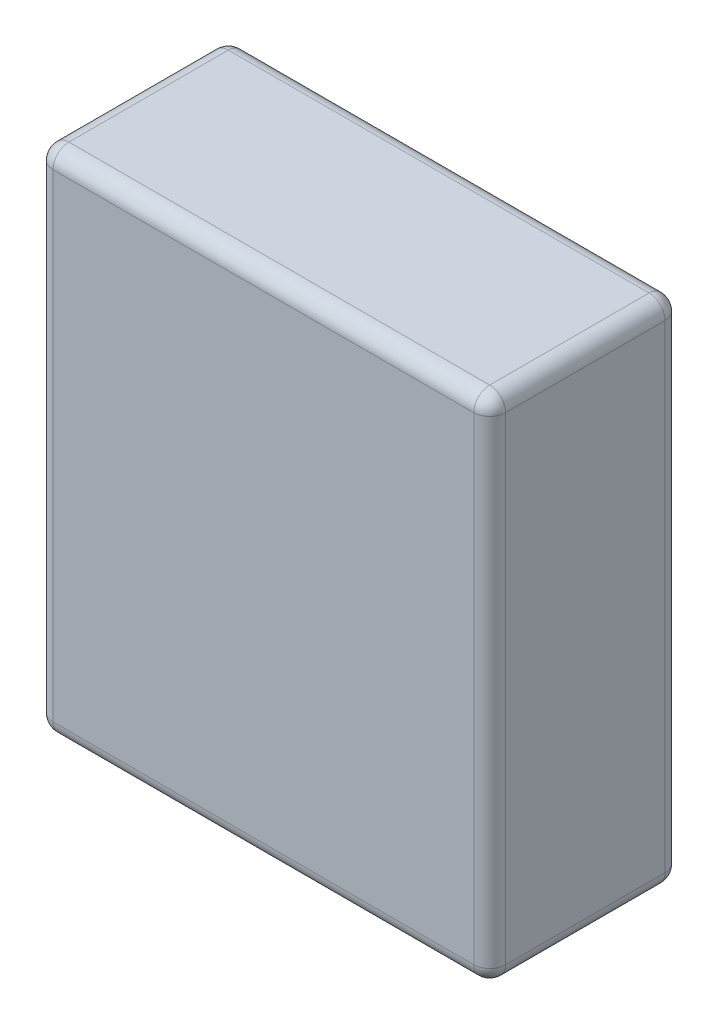
ISO-10303-21;
HEADER;
FILE_DESCRIPTION(('STEP AP214'),'2;1');
FILE_NAME('part.step','',(''),(''),'','','');
FILE_SCHEMA(('AUTOMOTIVE_DESIGN { 1 0 10303 214 1 1 1 1 }'));
ENDSEC;
DATA;
#1=APPLICATION_CONTEXT('core data for automotive mechanical design processes');
#2=APPLICATION_PROTOCOL_DEFINITION('international standard','automotive_design',2000,#1);
#3=PRODUCT_CONTEXT('',#1,'mechanical');
#4=PRODUCT('Part','Part','',(#3));
#5=PRODUCT_RELATED_PRODUCT_CATEGORY('part','',(#4));
#6=PRODUCT_DEFINITION_FORMATION('','',#4);
#7=PRODUCT_DEFINITION_CONTEXT('part definition',#1,'design');
#8=PRODUCT_DEFINITION('design','',#6,#7);
#9=PRODUCT_DEFINITION_SHAPE('','',#8);
#10=(LENGTH_UNIT() NAMED_UNIT(*) SI_UNIT(.MILLI.,.METRE.));
#11=(NAMED_UNIT(*) PLANE_ANGLE_UNIT() SI_UNIT($,.RADIAN.));
#12=(NAMED_UNIT(*) SI_UNIT($,.STERADIAN.) SOLID_ANGLE_UNIT());
#13=UNCERTAINTY_MEASURE_WITH_UNIT(LENGTH_MEASURE(1.E-05),#10,'distance_accuracy_value','');
#14=(GEOMETRIC_REPRESENTATION_CONTEXT(3) GLOBAL_UNCERTAINTY_ASSIGNED_CONTEXT((#13)) GLOBAL_UNIT_ASSIGNED_CONTEXT((#10,
#11,#12)) REPRESENTATION_CONTEXT('',''));
#15=CARTESIAN_POINT('',(0.,0.,0.));
#16=DIRECTION('',(0.,0.,1.));
#17=DIRECTION('',(1.,0.,0.));
#18=AXIS2_PLACEMENT_3D('',#15,#16,#17);
#19=CARTESIAN_POINT('',(-71.,160.,-30.));
#20=DIRECTION('',(1.,0.,0.));
#21=DIRECTION('',(0.,0.,-1.));
#22=AXIS2_PLACEMENT_3D('',#19,#20,#21);
#23=PLANE('',#22);
#24=DIRECTION('',(0.,-1.,0.));
#25=VECTOR('',#24,1.);
#26=CARTESIAN_POINT('',(-71.,160.,-25.));
#27=LINE('',#26,#25);
#28=CARTESIAN_POINT('',(-71.,155.,-25.));
#29=VERTEX_POINT('',#28);
#30=CARTESIAN_POINT('',(-71.,5.,-25.));
#31=VERTEX_POINT('',#30);
#32=EDGE_CURVE('E132',#29,#31,#27,.T.);
#33=ORIENTED_EDGE('',*,*,#32,.T.);
#34=DIRECTION('',(0.,0.,1.));
#35=VECTOR('',#34,1.);
#36=CARTESIAN_POINT('',(-71.,5.,30.));
#37=LINE('',#36,#35);
#38=CARTESIAN_POINT('',(-71.,5.,25.));
#39=VERTEX_POINT('',#38);
#40=EDGE_CURVE('E128',#31,#39,#37,.T.);
#41=ORIENTED_EDGE('',*,*,#40,.T.);
#42=DIRECTION('',(0.,-1.,0.));
#43=VECTOR('',#42,1.);
#44=CARTESIAN_POINT('',(-71.,160.,25.));
#45=LINE('',#44,#43);
#46=CARTESIAN_POINT('',(-71.,155.,25.));
#47=VERTEX_POINT('',#46);
#48=EDGE_CURVE('E123',#39,#47,#45,.F.);
#49=ORIENTED_EDGE('',*,*,#48,.T.);
#50=DIRECTION('',(0.,0.,1.));
#51=VECTOR('',#50,1.);
#52=CARTESIAN_POINT('',(-71.,155.,-30.));
#53=LINE('',#52,#51);
#54=EDGE_CURVE('E125',#47,#29,#53,.F.);
#55=ORIENTED_EDGE('',*,*,#54,.T.);
#56=EDGE_LOOP('',(#33,#41,#49,#55));
#57=FACE_BOUND('',#56,.T.);
#58=ADVANCED_FACE('F35',(#57),#23,.F.);
#59=CARTESIAN_POINT('',(71.,160.,30.));
#60=DIRECTION('',(0.,0.,-1.));
#61=DIRECTION('',(-1.,0.,0.));
#62=AXIS2_PLACEMENT_3D('',#59,#60,#61);
#63=PLANE('',#62);
#64=DIRECTION('',(0.,-1.,0.));
#65=VECTOR('',#64,1.);
#66=CARTESIAN_POINT('',(-66.,160.,30.));
#67=LINE('',#66,#65);
#68=CARTESIAN_POINT('',(-66.,155.,30.));
#69=VERTEX_POINT('',#68);
#70=CARTESIAN_POINT('',(-66.,5.,30.));
#71=VERTEX_POINT('',#70);
#72=EDGE_CURVE('E154',#69,#71,#67,.T.);
#73=ORIENTED_EDGE('',*,*,#72,.T.);
#74=DIRECTION('',(1.,0.,0.));
#75=VECTOR('',#74,1.);
#76=CARTESIAN_POINT('',(71.,5.,30.));
#77=LINE('',#76,#75);
#78=CARTESIAN_POINT('',(66.,5.,30.));
#79=VERTEX_POINT('',#78);
#80=EDGE_CURVE('E232',#71,#79,#77,.T.);
#81=ORIENTED_EDGE('',*,*,#80,.T.);
#82=DIRECTION('',(0.,-1.,0.));
#83=VECTOR('',#82,1.);
#84=CARTESIAN_POINT('',(66.,160.,30.));
#85=LINE('',#84,#83);
#86=CARTESIAN_POINT('',(66.,155.,30.));
#87=VERTEX_POINT('',#86);
#88=EDGE_CURVE('E225',#79,#87,#85,.F.);
#89=ORIENTED_EDGE('',*,*,#88,.T.);
#90=DIRECTION('',(1.,0.,0.));
#91=VECTOR('',#90,1.);
#92=CARTESIAN_POINT('',(71.,155.,30.));
#93=LINE('',#92,#91);
#94=EDGE_CURVE('E223',#87,#69,#93,.F.);
#95=ORIENTED_EDGE('',*,*,#94,.T.);
#96=EDGE_LOOP('',(#73,#81,#89,#95));
#97=FACE_BOUND('',#96,.T.);
#98=ADVANCED_FACE('F322',(#97),#63,.F.);
#99=CARTESIAN_POINT('',(71.,160.,-30.));
#100=DIRECTION('',(-1.,0.,0.));
#101=DIRECTION('',(0.,0.,1.));
#102=AXIS2_PLACEMENT_3D('',#99,#100,#101);
#103=PLANE('',#102);
#104=DIRECTION('',(0.,0.,-1.));
#105=VECTOR('',#104,1.);
#106=CARTESIAN_POINT('',(71.,5.,-30.));
#107=LINE('',#106,#105);
#108=CARTESIAN_POINT('',(71.,5.,25.));
#109=VERTEX_POINT('',#108);
#110=CARTESIAN_POINT('',(71.,5.,-25.));
#111=VERTEX_POINT('',#110);
#112=EDGE_CURVE('E219',#109,#111,#107,.T.);
#113=ORIENTED_EDGE('',*,*,#112,.T.);
#114=DIRECTION('',(0.,-1.,0.));
#115=VECTOR('',#114,1.);
#116=CARTESIAN_POINT('',(71.,160.,-25.));
#117=LINE('',#116,#115);
#118=CARTESIAN_POINT('',(71.,155.,-25.));
#119=VERTEX_POINT('',#118);
#120=EDGE_CURVE('E216',#111,#119,#117,.F.);
#121=ORIENTED_EDGE('',*,*,#120,.T.);
#122=DIRECTION('',(0.,0.,-1.));
#123=VECTOR('',#122,1.);
#124=CARTESIAN_POINT('',(71.,155.,-30.));
#125=LINE('',#124,#123);
#126=CARTESIAN_POINT('',(71.,155.,25.));
#127=VERTEX_POINT('',#126);
#128=EDGE_CURVE('E209',#119,#127,#125,.F.);
#129=ORIENTED_EDGE('',*,*,#128,.T.);
#130=DIRECTION('',(0.,-1.,0.));
#131=VECTOR('',#130,1.);
#132=CARTESIAN_POINT('',(71.,160.,25.));
#133=LINE('',#132,#131);
#134=EDGE_CURVE('E212',#127,#109,#133,.T.);
#135=ORIENTED_EDGE('',*,*,#134,.T.);
#136=EDGE_LOOP('',(#113,#121,#129,#135));
#137=FACE_BOUND('',#136,.T.);
#138=ADVANCED_FACE('F217',(#137),#103,.F.);
#139=CARTESIAN_POINT('',(71.,160.,-30.));
#140=DIRECTION('',(0.,0.,1.));
#141=DIRECTION('',(1.,0.,0.));
#142=AXIS2_PLACEMENT_3D('',#139,#140,#141);
#143=PLANE('',#142);
#144=DIRECTION('',(-1.,0.,0.));
#145=VECTOR('',#144,1.);
#146=CARTESIAN_POINT('',(-71.,5.,-30.));
#147=LINE('',#146,#145);
#148=CARTESIAN_POINT('',(66.,5.,-30.));
#149=VERTEX_POINT('',#148);
#150=CARTESIAN_POINT('',(-66.,5.,-30.));
#151=VERTEX_POINT('',#150);
#152=EDGE_CURVE('E281',#149,#151,#147,.T.);
#153=ORIENTED_EDGE('',*,*,#152,.T.);
#154=DIRECTION('',(0.,-1.,0.));
#155=VECTOR('',#154,1.);
#156=CARTESIAN_POINT('',(-66.,160.,-30.));
#157=LINE('',#156,#155);
#158=CARTESIAN_POINT('',(-66.,155.,-30.));
#159=VERTEX_POINT('',#158);
#160=EDGE_CURVE('E213',#151,#159,#157,.F.);
#161=ORIENTED_EDGE('',*,*,#160,.T.);
#162=DIRECTION('',(-1.,0.,0.));
#163=VECTOR('',#162,1.);
#164=CARTESIAN_POINT('',(71.,155.,-30.));
#165=LINE('',#164,#163);
#166=CARTESIAN_POINT('',(66.,155.,-30.));
#167=VERTEX_POINT('',#166);
#168=EDGE_CURVE('E274',#159,#167,#165,.F.);
#169=ORIENTED_EDGE('',*,*,#168,.T.);
#170=DIRECTION('',(0.,-1.,0.));
#171=VECTOR('',#170,1.);
#172=CARTESIAN_POINT('',(66.,160.,-30.));
#173=LINE('',#172,#171);
#174=EDGE_CURVE('E276',#167,#149,#173,.T.);
#175=ORIENTED_EDGE('',*,*,#174,.T.);
#176=EDGE_LOOP('',(#153,#161,#169,#175));
#177=FACE_BOUND('',#176,.T.);
#178=ADVANCED_FACE('F306',(#177),#143,.F.);
#179=CARTESIAN_POINT('',(0.,160.,0.));
#180=DIRECTION('',(0.,-1.,0.));
#181=DIRECTION('',(0.,0.,-1.));
#182=AXIS2_PLACEMENT_3D('',#179,#180,#181);
#183=PLANE('',#182);
#184=DIRECTION('',(0.,0.,-1.));
#185=VECTOR('',#184,1.);
#186=CARTESIAN_POINT('',(66.,160.,0.));
#187=LINE('',#186,#185);
#188=CARTESIAN_POINT('',(66.,160.,25.));
#189=VERTEX_POINT('',#188);
#190=CARTESIAN_POINT('',(66.,160.,-25.));
#191=VERTEX_POINT('',#190);
#192=EDGE_CURVE('E44',#189,#191,#187,.T.);
#193=ORIENTED_EDGE('',*,*,#192,.T.);
#194=DIRECTION('',(-1.,0.,0.));
#195=VECTOR('',#194,1.);
#196=CARTESIAN_POINT('',(0.,160.,-25.));
#197=LINE('',#196,#195);
#198=CARTESIAN_POINT('',(-66.,160.,-25.));
#199=VERTEX_POINT('',#198);
#200=EDGE_CURVE('E11',#191,#199,#197,.T.);
#201=ORIENTED_EDGE('',*,*,#200,.T.);
#202=DIRECTION('',(0.,0.,1.));
#203=VECTOR('',#202,1.);
#204=CARTESIAN_POINT('',(-66.,160.,0.));
#205=LINE('',#204,#203);
#206=CARTESIAN_POINT('',(-66.,160.,25.));
#207=VERTEX_POINT('',#206);
#208=EDGE_CURVE('E234',#199,#207,#205,.T.);
#209=ORIENTED_EDGE('',*,*,#208,.T.);
#210=DIRECTION('',(1.,0.,0.));
#211=VECTOR('',#210,1.);
#212=CARTESIAN_POINT('',(0.,160.,25.));
#213=LINE('',#212,#211);
#214=EDGE_CURVE('E55',#207,#189,#213,.T.);
#215=ORIENTED_EDGE('',*,*,#214,.T.);
#216=EDGE_LOOP('',(#193,#201,#209,#215));
#217=FACE_BOUND('',#216,.T.);
#218=ADVANCED_FACE('F485',(#217),#183,.F.);
#219=CARTESIAN_POINT('',(0.,0.,0.));
#220=DIRECTION('',(0.,-1.,0.));
#221=DIRECTION('',(0.,0.,-1.));
#222=AXIS2_PLACEMENT_3D('',#219,#220,#221);
#223=PLANE('',#222);
#224=DIRECTION('',(1.,0.,0.));
#225=VECTOR('',#224,1.);
#226=CARTESIAN_POINT('',(-71.,0.,25.));
#227=LINE('',#226,#225);
#228=CARTESIAN_POINT('',(66.,0.,25.));
#229=VERTEX_POINT('',#228);
#230=CARTESIAN_POINT('',(-66.,0.,25.));
#231=VERTEX_POINT('',#230);
#232=EDGE_CURVE('E270',#229,#231,#227,.F.);
#233=ORIENTED_EDGE('',*,*,#232,.T.);
#234=DIRECTION('',(0.,0.,1.));
#235=VECTOR('',#234,1.);
#236=CARTESIAN_POINT('',(-66.,0.,-30.));
#237=LINE('',#236,#235);
#238=CARTESIAN_POINT('',(-66.,0.,-25.));
#239=VERTEX_POINT('',#238);
#240=EDGE_CURVE('E264',#231,#239,#237,.F.);
#241=ORIENTED_EDGE('',*,*,#240,.T.);
#242=DIRECTION('',(-1.,0.,0.));
#243=VECTOR('',#242,1.);
#244=CARTESIAN_POINT('',(71.,0.,-25.));
#245=LINE('',#244,#243);
#246=CARTESIAN_POINT('',(66.,0.,-25.));
#247=VERTEX_POINT('',#246);
#248=EDGE_CURVE('E258',#239,#247,#245,.F.);
#249=ORIENTED_EDGE('',*,*,#248,.T.);
#250=DIRECTION('',(0.,0.,-1.));
#251=VECTOR('',#250,1.);
#252=CARTESIAN_POINT('',(66.,0.,30.));
#253=LINE('',#252,#251);
#254=EDGE_CURVE('E265',#247,#229,#253,.F.);
#255=ORIENTED_EDGE('',*,*,#254,.T.);
#256=EDGE_LOOP('',(#233,#241,#249,#255));
#257=FACE_BOUND('',#256,.T.);
#258=ADVANCED_FACE('F268',(#257),#223,.T.);
#259=CARTESIAN_POINT('',(66.,155.,0.));
#260=DIRECTION('',(0.,0.,-1.));
#261=DIRECTION('',(-1.,0.,0.));
#262=AXIS2_PLACEMENT_3D('',#259,#260,#261);
#263=CYLINDRICAL_SURFACE('',#262,5.);
#264=CARTESIAN_POINT('',(66.,155.,-25.));
#265=DIRECTION('',(0.,0.,-1.));
#266=DIRECTION('',(-1.,0.,0.));
#267=AXIS2_PLACEMENT_3D('',#264,#265,#266);
#268=CIRCLE('',#267,5.);
#269=EDGE_CURVE('E39',#191,#119,#268,.T.);
#270=ORIENTED_EDGE('',*,*,#269,.F.);
#271=ORIENTED_EDGE('',*,*,#192,.F.);
#272=CARTESIAN_POINT('',(66.,155.,25.));
#273=DIRECTION('',(0.,0.,1.));
#274=DIRECTION('',(0.,-1.,0.));
#275=AXIS2_PLACEMENT_3D('',#272,#273,#274);
#276=CIRCLE('',#275,5.);
#277=EDGE_CURVE('E194',#127,#189,#276,.T.);
#278=ORIENTED_EDGE('',*,*,#277,.F.);
#279=ORIENTED_EDGE('',*,*,#128,.F.);
#280=EDGE_LOOP('',(#270,#271,#278,#279));
#281=FACE_BOUND('',#280,.T.);
#282=ADVANCED_FACE('F37',(#281),#263,.T.);
#283=CARTESIAN_POINT('',(66.,155.,-25.));
#284=DIRECTION('',(0.,0.,1.));
#285=DIRECTION('',(1.,0.,0.));
#286=AXIS2_PLACEMENT_3D('',#283,#284,#285);
#287=SPHERICAL_SURFACE('',#286,5.);
#288=CARTESIAN_POINT('',(66.,155.,-25.));
#289=DIRECTION('',(1.,0.,0.));
#290=DIRECTION('',(0.,1.,0.));
#291=AXIS2_PLACEMENT_3D('',#288,#289,#290);
#292=CIRCLE('',#291,5.);
#293=EDGE_CURVE('E190',#191,#167,#292,.F.);
#294=ORIENTED_EDGE('',*,*,#293,.F.);
#295=ORIENTED_EDGE('',*,*,#269,.T.);
#296=CARTESIAN_POINT('',(66.,155.,-25.));
#297=DIRECTION('',(0.,1.,0.));
#298=DIRECTION('',(0.,0.,1.));
#299=AXIS2_PLACEMENT_3D('',#296,#297,#298);
#300=CIRCLE('',#299,5.);
#301=EDGE_CURVE('E193',#167,#119,#300,.F.);
#302=ORIENTED_EDGE('',*,*,#301,.F.);
#303=EDGE_LOOP('',(#294,#295,#302));
#304=FACE_BOUND('',#303,.T.);
#305=ADVANCED_FACE('F205',(#304),#287,.T.);
#306=CARTESIAN_POINT('',(66.,155.,25.));
#307=DIRECTION('',(0.,0.,1.));
#308=DIRECTION('',(1.,0.,0.));
#309=AXIS2_PLACEMENT_3D('',#306,#307,#308);
#310=SPHERICAL_SURFACE('',#309,5.);
#311=CARTESIAN_POINT('',(66.,155.,25.));
#312=DIRECTION('',(0.,1.,0.));
#313=DIRECTION('',(0.,0.,1.));
#314=AXIS2_PLACEMENT_3D('',#311,#312,#313);
#315=CIRCLE('',#314,5.);
#316=EDGE_CURVE('E184',#127,#87,#315,.F.);
#317=ORIENTED_EDGE('',*,*,#316,.F.);
#318=ORIENTED_EDGE('',*,*,#277,.T.);
#319=CARTESIAN_POINT('',(66.,155.,25.));
#320=DIRECTION('',(1.,0.,0.));
#321=DIRECTION('',(0.,0.,-1.));
#322=AXIS2_PLACEMENT_3D('',#319,#320,#321);
#323=CIRCLE('',#322,5.);
#324=EDGE_CURVE('E187',#87,#189,#323,.F.);
#325=ORIENTED_EDGE('',*,*,#324,.F.);
#326=EDGE_LOOP('',(#317,#318,#325));
#327=FACE_BOUND('',#326,.T.);
#328=ADVANCED_FACE('F458',(#327),#310,.T.);
#329=CARTESIAN_POINT('',(66.,160.,-25.));
#330=DIRECTION('',(0.,-1.,0.));
#331=DIRECTION('',(0.,0.,-1.));
#332=AXIS2_PLACEMENT_3D('',#329,#330,#331);
#333=CYLINDRICAL_SURFACE('',#332,5.);
#334=ORIENTED_EDGE('',*,*,#301,.T.);
#335=ORIENTED_EDGE('',*,*,#120,.F.);
#336=CARTESIAN_POINT('',(66.,5.,-25.));
#337=DIRECTION('',(0.,-1.,0.));
#338=DIRECTION('',(0.,0.,-1.));
#339=AXIS2_PLACEMENT_3D('',#336,#337,#338);
#340=CIRCLE('',#339,5.);
#341=EDGE_CURVE('E178',#149,#111,#340,.T.);
#342=ORIENTED_EDGE('',*,*,#341,.F.);
#343=ORIENTED_EDGE('',*,*,#174,.F.);
#344=EDGE_LOOP('',(#334,#335,#342,#343));
#345=FACE_BOUND('',#344,.T.);
#346=ADVANCED_FACE('F308',(#345),#333,.T.);
#347=CARTESIAN_POINT('',(0.,155.,-25.));
#348=DIRECTION('',(-1.,0.,0.));
#349=DIRECTION('',(0.,0.,1.));
#350=AXIS2_PLACEMENT_3D('',#347,#348,#349);
#351=CYLINDRICAL_SURFACE('',#350,5.);
#352=ORIENTED_EDGE('',*,*,#293,.T.);
#353=ORIENTED_EDGE('',*,*,#168,.F.);
#354=CARTESIAN_POINT('',(-66.,155.,-25.));
#355=DIRECTION('',(-1.,0.,0.));
#356=DIRECTION('',(0.,0.,1.));
#357=AXIS2_PLACEMENT_3D('',#354,#355,#356);
#358=CIRCLE('',#357,5.);
#359=EDGE_CURVE('E175',#199,#159,#358,.T.);
#360=ORIENTED_EDGE('',*,*,#359,.F.);
#361=ORIENTED_EDGE('',*,*,#200,.F.);
#362=EDGE_LOOP('',(#352,#353,#360,#361));
#363=FACE_BOUND('',#362,.T.);
#364=ADVANCED_FACE('F442',(#363),#351,.T.);
#365=CARTESIAN_POINT('',(-66.,155.,0.));
#366=DIRECTION('',(0.,0.,1.));
#367=DIRECTION('',(1.,0.,0.));
#368=AXIS2_PLACEMENT_3D('',#365,#366,#367);
#369=CYLINDRICAL_SURFACE('',#368,5.);
#370=CARTESIAN_POINT('',(-66.,155.,25.));
#371=DIRECTION('',(0.,0.,1.));
#372=DIRECTION('',(1.,0.,0.));
#373=AXIS2_PLACEMENT_3D('',#370,#371,#372);
#374=CIRCLE('',#373,5.);
#375=EDGE_CURVE('E139',#207,#47,#374,.T.);
#376=ORIENTED_EDGE('',*,*,#375,.F.);
#377=ORIENTED_EDGE('',*,*,#208,.F.);
#378=CARTESIAN_POINT('',(-66.,155.,-25.));
#379=DIRECTION('',(0.,0.,-1.));
#380=DIRECTION('',(-1.,0.,0.));
#381=AXIS2_PLACEMENT_3D('',#378,#379,#380);
#382=CIRCLE('',#381,5.);
#383=EDGE_CURVE('E141',#29,#199,#382,.T.);
#384=ORIENTED_EDGE('',*,*,#383,.F.);
#385=ORIENTED_EDGE('',*,*,#54,.F.);
#386=EDGE_LOOP('',(#376,#377,#384,#385));
#387=FACE_BOUND('',#386,.T.);
#388=ADVANCED_FACE('F137',(#387),#369,.T.);
#389=CARTESIAN_POINT('',(0.,155.,25.));
#390=DIRECTION('',(1.,0.,0.));
#391=DIRECTION('',(0.,0.,-1.));
#392=AXIS2_PLACEMENT_3D('',#389,#390,#391);
#393=CYLINDRICAL_SURFACE('',#392,5.);
#394=ORIENTED_EDGE('',*,*,#324,.T.);
#395=ORIENTED_EDGE('',*,*,#214,.F.);
#396=CARTESIAN_POINT('',(-66.,155.,25.));
#397=DIRECTION('',(-1.,0.,0.));
#398=DIRECTION('',(0.,-1.,0.));
#399=AXIS2_PLACEMENT_3D('',#396,#397,#398);
#400=CIRCLE('',#399,5.);
#401=EDGE_CURVE('E150',#69,#207,#400,.T.);
#402=ORIENTED_EDGE('',*,*,#401,.F.);
#403=ORIENTED_EDGE('',*,*,#94,.F.);
#404=EDGE_LOOP('',(#394,#395,#402,#403));
#405=FACE_BOUND('',#404,.T.);
#406=ADVANCED_FACE('F426',(#405),#393,.T.);
#407=CARTESIAN_POINT('',(66.,160.,25.));
#408=DIRECTION('',(0.,-1.,0.));
#409=DIRECTION('',(0.,0.,-1.));
#410=AXIS2_PLACEMENT_3D('',#407,#408,#409);
#411=CYLINDRICAL_SURFACE('',#410,5.);
#412=ORIENTED_EDGE('',*,*,#316,.T.);
#413=ORIENTED_EDGE('',*,*,#88,.F.);
#414=CARTESIAN_POINT('',(66.,5.,25.));
#415=DIRECTION('',(0.,-1.,0.));
#416=DIRECTION('',(0.,0.,-1.));
#417=AXIS2_PLACEMENT_3D('',#414,#415,#416);
#418=CIRCLE('',#417,5.);
#419=EDGE_CURVE('E170',#109,#79,#418,.T.);
#420=ORIENTED_EDGE('',*,*,#419,.F.);
#421=ORIENTED_EDGE('',*,*,#134,.F.);
#422=EDGE_LOOP('',(#412,#413,#420,#421));
#423=FACE_BOUND('',#422,.T.);
#424=ADVANCED_FACE('F292',(#423),#411,.T.);
#425=CARTESIAN_POINT('',(66.,5.,-30.));
#426=DIRECTION('',(0.,0.,1.));
#427=DIRECTION('',(1.,0.,0.));
#428=AXIS2_PLACEMENT_3D('',#425,#426,#427);
#429=CYLINDRICAL_SURFACE('',#428,5.);
#430=CARTESIAN_POINT('',(66.,5.,-25.));
#431=DIRECTION('',(0.,0.,-1.));
#432=DIRECTION('',(-1.,0.,0.));
#433=AXIS2_PLACEMENT_3D('',#430,#431,#432);
#434=CIRCLE('',#433,5.);
#435=EDGE_CURVE('E181',#111,#247,#434,.T.);
#436=ORIENTED_EDGE('',*,*,#435,.F.);
#437=ORIENTED_EDGE('',*,*,#112,.F.);
#438=CARTESIAN_POINT('',(66.,5.,25.));
#439=DIRECTION('',(0.,0.,1.));
#440=DIRECTION('',(1.,0.,0.));
#441=AXIS2_PLACEMENT_3D('',#438,#439,#440);
#442=CIRCLE('',#441,5.);
#443=EDGE_CURVE('E167',#229,#109,#442,.T.);
#444=ORIENTED_EDGE('',*,*,#443,.F.);
#445=ORIENTED_EDGE('',*,*,#254,.F.);
#446=EDGE_LOOP('',(#436,#437,#444,#445));
#447=FACE_BOUND('',#446,.T.);
#448=ADVANCED_FACE('F289',(#447),#429,.T.);
#449=CARTESIAN_POINT('',(66.,5.,-25.));
#450=DIRECTION('',(0.,0.,1.));
#451=DIRECTION('',(1.,0.,0.));
#452=AXIS2_PLACEMENT_3D('',#449,#450,#451);
#453=SPHERICAL_SURFACE('',#452,5.);
#454=ORIENTED_EDGE('',*,*,#341,.T.);
#455=ORIENTED_EDGE('',*,*,#435,.T.);
#456=CARTESIAN_POINT('',(66.,5.,-25.));
#457=DIRECTION('',(1.,0.,0.));
#458=DIRECTION('',(0.,0.,-1.));
#459=AXIS2_PLACEMENT_3D('',#456,#457,#458);
#460=CIRCLE('',#459,5.);
#461=EDGE_CURVE('E158',#149,#247,#460,.F.);
#462=ORIENTED_EDGE('',*,*,#461,.F.);
#463=EDGE_LOOP('',(#454,#455,#462));
#464=FACE_BOUND('',#463,.T.);
#465=ADVANCED_FACE('F310',(#464),#453,.T.);
#466=CARTESIAN_POINT('',(-66.,155.,-25.));
#467=DIRECTION('',(0.,0.,1.));
#468=DIRECTION('',(1.,0.,0.));
#469=AXIS2_PLACEMENT_3D('',#466,#467,#468);
#470=SPHERICAL_SURFACE('',#469,5.);
#471=ORIENTED_EDGE('',*,*,#383,.T.);
#472=ORIENTED_EDGE('',*,*,#359,.T.);
#473=CARTESIAN_POINT('',(-66.,155.,-25.));
#474=DIRECTION('',(0.,1.,0.));
#475=DIRECTION('',(0.,0.,1.));
#476=AXIS2_PLACEMENT_3D('',#473,#474,#475);
#477=CIRCLE('',#476,5.);
#478=EDGE_CURVE('E155',#29,#159,#477,.F.);
#479=ORIENTED_EDGE('',*,*,#478,.F.);
#480=EDGE_LOOP('',(#471,#472,#479));
#481=FACE_BOUND('',#480,.T.);
#482=ADVANCED_FACE('F312',(#481),#470,.T.);
#483=CARTESIAN_POINT('',(-66.,155.,25.));
#484=DIRECTION('',(0.,0.,1.));
#485=DIRECTION('',(1.,0.,0.));
#486=AXIS2_PLACEMENT_3D('',#483,#484,#485);
#487=SPHERICAL_SURFACE('',#486,5.);
#488=ORIENTED_EDGE('',*,*,#401,.T.);
#489=ORIENTED_EDGE('',*,*,#375,.T.);
#490=CARTESIAN_POINT('',(-66.,155.,25.));
#491=DIRECTION('',(0.,1.,0.));
#492=DIRECTION('',(0.,0.,1.));
#493=AXIS2_PLACEMENT_3D('',#490,#491,#492);
#494=CIRCLE('',#493,5.);
#495=EDGE_CURVE('E147',#69,#47,#494,.F.);
#496=ORIENTED_EDGE('',*,*,#495,.F.);
#497=EDGE_LOOP('',(#488,#489,#496));
#498=FACE_BOUND('',#497,.T.);
#499=ADVANCED_FACE('F146',(#498),#487,.T.);
#500=CARTESIAN_POINT('',(66.,5.,25.));
#501=DIRECTION('',(0.,0.,1.));
#502=DIRECTION('',(1.,0.,0.));
#503=AXIS2_PLACEMENT_3D('',#500,#501,#502);
#504=SPHERICAL_SURFACE('',#503,5.);
#505=ORIENTED_EDGE('',*,*,#443,.T.);
#506=ORIENTED_EDGE('',*,*,#419,.T.);
#507=CARTESIAN_POINT('',(66.,5.,25.));
#508=DIRECTION('',(1.,0.,0.));
#509=DIRECTION('',(0.,0.,-1.));
#510=AXIS2_PLACEMENT_3D('',#507,#508,#509);
#511=CIRCLE('',#510,5.);
#512=EDGE_CURVE('E156',#229,#79,#511,.F.);
#513=ORIENTED_EDGE('',*,*,#512,.F.);
#514=EDGE_LOOP('',(#505,#506,#513));
#515=FACE_BOUND('',#514,.T.);
#516=ADVANCED_FACE('F294',(#515),#504,.T.);
#517=CARTESIAN_POINT('',(71.,5.,-25.));
#518=DIRECTION('',(1.,0.,0.));
#519=DIRECTION('',(0.,0.,-1.));
#520=AXIS2_PLACEMENT_3D('',#517,#518,#519);
#521=CYLINDRICAL_SURFACE('',#520,5.);
#522=ORIENTED_EDGE('',*,*,#461,.T.);
#523=ORIENTED_EDGE('',*,*,#248,.F.);
#524=CARTESIAN_POINT('',(-66.,5.,-25.));
#525=DIRECTION('',(-1.,0.,0.));
#526=DIRECTION('',(0.,0.,1.));
#527=AXIS2_PLACEMENT_3D('',#524,#525,#526);
#528=CIRCLE('',#527,5.);
#529=EDGE_CURVE('E161',#151,#239,#528,.T.);
#530=ORIENTED_EDGE('',*,*,#529,.F.);
#531=ORIENTED_EDGE('',*,*,#152,.F.);
#532=EDGE_LOOP('',(#522,#523,#530,#531));
#533=FACE_BOUND('',#532,.T.);
#534=ADVANCED_FACE('F260',(#533),#521,.T.);
#535=CARTESIAN_POINT('',(-66.,160.,-25.));
#536=DIRECTION('',(0.,-1.,0.));
#537=DIRECTION('',(0.,0.,-1.));
#538=AXIS2_PLACEMENT_3D('',#535,#536,#537);
#539=CYLINDRICAL_SURFACE('',#538,5.);
#540=ORIENTED_EDGE('',*,*,#478,.T.);
#541=ORIENTED_EDGE('',*,*,#160,.F.);
#542=CARTESIAN_POINT('',(-66.,5.,-25.));
#543=DIRECTION('',(0.,-1.,0.));
#544=DIRECTION('',(0.,0.,-1.));
#545=AXIS2_PLACEMENT_3D('',#542,#543,#544);
#546=CIRCLE('',#545,5.);
#547=EDGE_CURVE('E247',#31,#151,#546,.T.);
#548=ORIENTED_EDGE('',*,*,#547,.F.);
#549=ORIENTED_EDGE('',*,*,#32,.F.);
#550=EDGE_LOOP('',(#540,#541,#548,#549));
#551=FACE_BOUND('',#550,.T.);
#552=ADVANCED_FACE('F304',(#551),#539,.T.);
#553=CARTESIAN_POINT('',(-66.,160.,25.));
#554=DIRECTION('',(0.,-1.,0.));
#555=DIRECTION('',(0.,0.,-1.));
#556=AXIS2_PLACEMENT_3D('',#553,#554,#555);
#557=CYLINDRICAL_SURFACE('',#556,5.);
#558=ORIENTED_EDGE('',*,*,#495,.T.);
#559=ORIENTED_EDGE('',*,*,#48,.F.);
#560=CARTESIAN_POINT('',(-66.,5.,25.));
#561=DIRECTION('',(0.,-1.,0.));
#562=DIRECTION('',(0.,0.,-1.));
#563=AXIS2_PLACEMENT_3D('',#560,#561,#562);
#564=CIRCLE('',#563,5.);
#565=EDGE_CURVE('E244',#71,#39,#564,.T.);
#566=ORIENTED_EDGE('',*,*,#565,.F.);
#567=ORIENTED_EDGE('',*,*,#72,.F.);
#568=EDGE_LOOP('',(#558,#559,#566,#567));
#569=FACE_BOUND('',#568,.T.);
#570=ADVANCED_FACE('F152',(#569),#557,.T.);
#571=CARTESIAN_POINT('',(71.,5.,25.));
#572=DIRECTION('',(-1.,0.,0.));
#573=DIRECTION('',(0.,0.,1.));
#574=AXIS2_PLACEMENT_3D('',#571,#572,#573);
#575=CYLINDRICAL_SURFACE('',#574,5.);
#576=ORIENTED_EDGE('',*,*,#512,.T.);
#577=ORIENTED_EDGE('',*,*,#80,.F.);
#578=CARTESIAN_POINT('',(-66.,5.,25.));
#579=DIRECTION('',(-1.,0.,0.));
#580=DIRECTION('',(0.,0.,1.));
#581=AXIS2_PLACEMENT_3D('',#578,#579,#580);
#582=CIRCLE('',#581,5.);
#583=EDGE_CURVE('E242',#231,#71,#582,.T.);
#584=ORIENTED_EDGE('',*,*,#583,.F.);
#585=ORIENTED_EDGE('',*,*,#232,.F.);
#586=EDGE_LOOP('',(#576,#577,#584,#585));
#587=FACE_BOUND('',#586,.T.);
#588=ADVANCED_FACE('F297',(#587),#575,.T.);
#589=CARTESIAN_POINT('',(-66.,5.,-25.));
#590=DIRECTION('',(0.,0.,1.));
#591=DIRECTION('',(1.,0.,0.));
#592=AXIS2_PLACEMENT_3D('',#589,#590,#591);
#593=SPHERICAL_SURFACE('',#592,5.);
#594=ORIENTED_EDGE('',*,*,#547,.T.);
#595=ORIENTED_EDGE('',*,*,#529,.T.);
#596=CARTESIAN_POINT('',(-66.,5.,-25.));
#597=DIRECTION('',(0.,0.,-1.));
#598=DIRECTION('',(-1.,0.,0.));
#599=AXIS2_PLACEMENT_3D('',#596,#597,#598);
#600=CIRCLE('',#599,5.);
#601=EDGE_CURVE('E240',#31,#239,#600,.F.);
#602=ORIENTED_EDGE('',*,*,#601,.F.);
#603=EDGE_LOOP('',(#594,#595,#602));
#604=FACE_BOUND('',#603,.T.);
#605=ADVANCED_FACE('F254',(#604),#593,.T.);
#606=CARTESIAN_POINT('',(-66.,5.,25.));
#607=DIRECTION('',(0.,0.,1.));
#608=DIRECTION('',(1.,0.,0.));
#609=AXIS2_PLACEMENT_3D('',#606,#607,#608);
#610=SPHERICAL_SURFACE('',#609,5.);
#611=ORIENTED_EDGE('',*,*,#583,.T.);
#612=ORIENTED_EDGE('',*,*,#565,.T.);
#613=CARTESIAN_POINT('',(-66.,5.,25.));
#614=DIRECTION('',(0.,0.,1.));
#615=DIRECTION('',(1.,0.,0.));
#616=AXIS2_PLACEMENT_3D('',#613,#614,#615);
#617=CIRCLE('',#616,5.);
#618=EDGE_CURVE('E238',#231,#39,#617,.F.);
#619=ORIENTED_EDGE('',*,*,#618,.F.);
#620=EDGE_LOOP('',(#611,#612,#619));
#621=FACE_BOUND('',#620,.T.);
#622=ADVANCED_FACE('F334',(#621),#610,.T.);
#623=CARTESIAN_POINT('',(-66.,5.,-30.));
#624=DIRECTION('',(0.,0.,-1.));
#625=DIRECTION('',(-1.,0.,0.));
#626=AXIS2_PLACEMENT_3D('',#623,#624,#625);
#627=CYLINDRICAL_SURFACE('',#626,5.);
#628=ORIENTED_EDGE('',*,*,#601,.T.);
#629=ORIENTED_EDGE('',*,*,#240,.F.);
#630=ORIENTED_EDGE('',*,*,#618,.T.);
#631=ORIENTED_EDGE('',*,*,#40,.F.);
#632=EDGE_LOOP('',(#628,#629,#630,#631));
#633=FACE_BOUND('',#632,.T.);
#634=ADVANCED_FACE('F331',(#633),#627,.T.);
#635=CLOSED_SHELL('',(#58,#98,#138,#178,#218,#258,#282,#305,#328,#346,#364,#388,#406,#424,#448,
#465,#482,#499,#516,#534,#552,#570,#588,#605,#622,#634));
#636=MANIFOLD_SOLID_BREP('B2',#635);
#637=ADVANCED_BREP_SHAPE_REPRESENTATION('',(#18,#636),#14);
#638=SHAPE_DEFINITION_REPRESENTATION(#9,#637);
ENDSEC;
END-ISO-10303-21;
